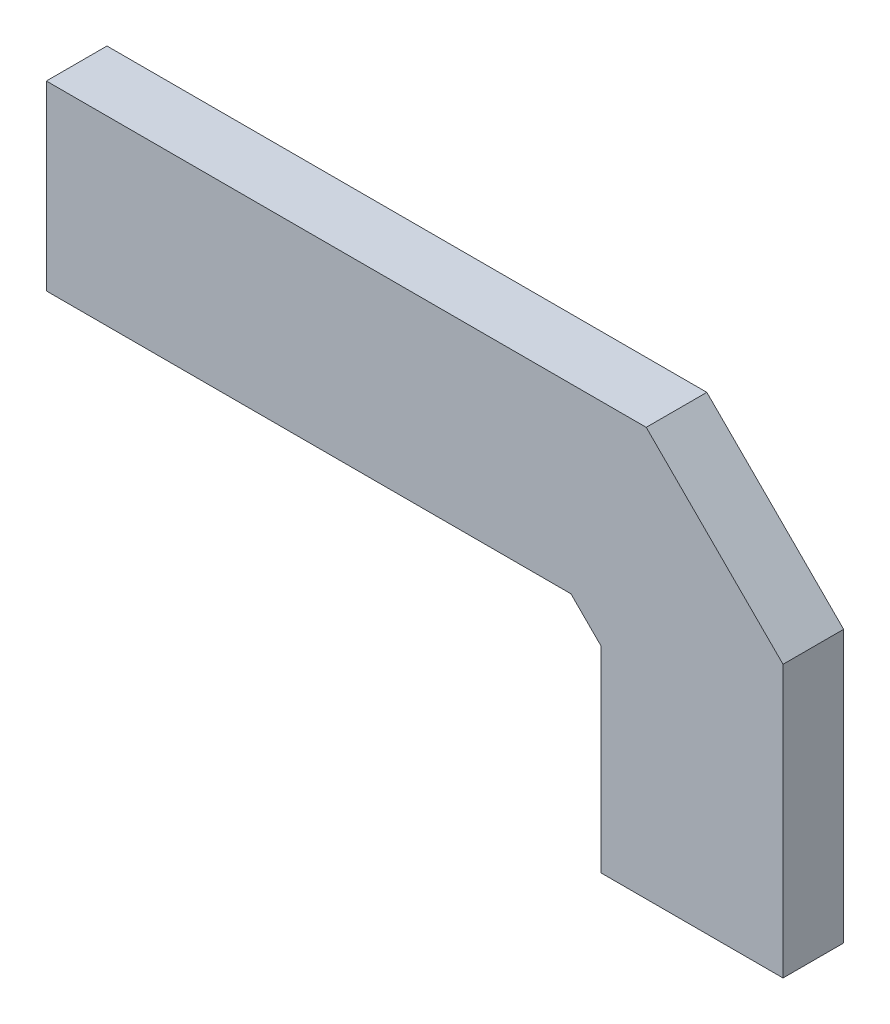
ISO-10303-21;
HEADER;
FILE_DESCRIPTION(('STEP AP214'),'2;1');
FILE_NAME('part.step','',(''),(''),'','','');
FILE_SCHEMA(('AUTOMOTIVE_DESIGN { 1 0 10303 214 1 1 1 1 }'));
ENDSEC;
DATA;
#1=APPLICATION_CONTEXT('core data for automotive mechanical design processes');
#2=APPLICATION_PROTOCOL_DEFINITION('international standard','automotive_design',2000,#1);
#3=PRODUCT_CONTEXT('',#1,'mechanical');
#4=PRODUCT('Part','Part','',(#3));
#5=PRODUCT_RELATED_PRODUCT_CATEGORY('part','',(#4));
#6=PRODUCT_DEFINITION_FORMATION('','',#4);
#7=PRODUCT_DEFINITION_CONTEXT('part definition',#1,'design');
#8=PRODUCT_DEFINITION('design','',#6,#7);
#9=PRODUCT_DEFINITION_SHAPE('','',#8);
#10=(LENGTH_UNIT() NAMED_UNIT(*) SI_UNIT(.MILLI.,.METRE.));
#11=(NAMED_UNIT(*) PLANE_ANGLE_UNIT() SI_UNIT($,.RADIAN.));
#12=(NAMED_UNIT(*) SI_UNIT($,.STERADIAN.) SOLID_ANGLE_UNIT());
#13=UNCERTAINTY_MEASURE_WITH_UNIT(LENGTH_MEASURE(1.E-05),#10,'distance_accuracy_value','');
#14=(GEOMETRIC_REPRESENTATION_CONTEXT(3) GLOBAL_UNCERTAINTY_ASSIGNED_CONTEXT((#13)) GLOBAL_UNIT_ASSIGNED_CONTEXT((#10,
#11,#12)) REPRESENTATION_CONTEXT('',''));
#15=CARTESIAN_POINT('',(0.,0.,0.));
#16=DIRECTION('',(0.,0.,1.));
#17=DIRECTION('',(1.,0.,0.));
#18=AXIS2_PLACEMENT_3D('',#15,#16,#17);
#19=CARTESIAN_POINT('',(0.,0.,0.5));
#20=DIRECTION('',(0.,0.,1.));
#21=DIRECTION('',(1.,0.,0.));
#22=AXIS2_PLACEMENT_3D('',#19,#20,#21);
#23=PLANE('',#22);
#24=DIRECTION('',(0.,-1.,0.));
#25=VECTOR('',#24,1.);
#26=CARTESIAN_POINT('',(33.1099999999967,0.,0.5));
#27=LINE('',#26,#25);
#28=CARTESIAN_POINT('',(33.1099999999967,-0.621320343562755,0.5));
#29=VERTEX_POINT('',#28);
#30=CARTESIAN_POINT('',(33.1099999999967,-2.2413203435653,0.5));
#31=VERTEX_POINT('',#30);
#32=EDGE_CURVE('E11',#29,#31,#27,.T.);
#33=ORIENTED_EDGE('',*,*,#32,.T.);
#34=DIRECTION('',(1.,0.,0.));
#35=VECTOR('',#34,1.);
#36=CARTESIAN_POINT('',(0.,-2.2413203435652,0.5));
#37=LINE('',#36,#35);
#38=CARTESIAN_POINT('',(34.6100000000004,-2.2413203435653,0.5));
#39=VERTEX_POINT('',#38);
#40=EDGE_CURVE('E24',#31,#39,#37,.T.);
#41=ORIENTED_EDGE('',*,*,#40,.T.);
#42=DIRECTION('',(0.,1.,0.));
#43=VECTOR('',#42,1.);
#44=CARTESIAN_POINT('',(34.6100000000005,-2.41073942293827E-13,0.5));
#45=LINE('',#44,#43);
#46=CARTESIAN_POINT('',(34.6100000000005,0.,0.5));
#47=VERTEX_POINT('',#46);
#48=EDGE_CURVE('E145',#39,#47,#45,.T.);
#49=ORIENTED_EDGE('',*,*,#48,.T.);
#50=DIRECTION('',(-0.70710678118656,0.707106781186535,0.));
#51=VECTOR('',#50,1.);
#52=CARTESIAN_POINT('',(17.3049999999996,17.3050000000002,0.5));
#53=LINE('',#52,#51);
#54=CARTESIAN_POINT('',(33.4813203435665,1.1286796564339,0.5));
#55=VERTEX_POINT('',#54);
#56=EDGE_CURVE('E143',#47,#55,#53,.T.);
#57=ORIENTED_EDGE('',*,*,#56,.T.);
#58=DIRECTION('',(1.,0.,0.));
#59=VECTOR('',#58,1.);
#60=CARTESIAN_POINT('',(0.,1.1286796564339,0.5));
#61=LINE('',#60,#59);
#62=CARTESIAN_POINT('',(28.5325000000004,1.1286796564339,0.5));
#63=VERTEX_POINT('',#62);
#64=EDGE_CURVE('E102',#63,#55,#61,.T.);
#65=ORIENTED_EDGE('',*,*,#64,.F.);
#66=DIRECTION('',(0.,-1.,0.));
#67=VECTOR('',#66,1.);
#68=CARTESIAN_POINT('',(28.5325000000004,0.,0.5));
#69=LINE('',#68,#67);
#70=CARTESIAN_POINT('',(28.5325000000004,-0.371320343572933,0.5));
#71=VERTEX_POINT('',#70);
#72=EDGE_CURVE('E140',#63,#71,#69,.T.);
#73=ORIENTED_EDGE('',*,*,#72,.T.);
#74=DIRECTION('',(1.,0.,0.));
#75=VECTOR('',#74,1.);
#76=CARTESIAN_POINT('',(0.,-0.371320343572807,0.5));
#77=LINE('',#76,#75);
#78=CARTESIAN_POINT('',(32.8600000000069,-0.371320343572952,0.5));
#79=VERTEX_POINT('',#78);
#80=EDGE_CURVE('E138',#71,#79,#77,.T.);
#81=ORIENTED_EDGE('',*,*,#80,.T.);
#82=DIRECTION('',(0.707106781186583,-0.707106781186512,0.));
#83=VECTOR('',#82,1.);
#84=CARTESIAN_POINT('',(16.2443398282153,16.2443398282169,0.5));
#85=LINE('',#84,#83);
#86=EDGE_CURVE('E136',#79,#29,#85,.T.);
#87=ORIENTED_EDGE('',*,*,#86,.T.);
#88=EDGE_LOOP('',(#33,#41,#49,#57,#65,#73,#81,#87));
#89=FACE_BOUND('',#88,.T.);
#90=ADVANCED_FACE('F17',(#89),#23,.T.);
#91=CARTESIAN_POINT('',(34.6100000000005,-2.41073942293827E-13,0.5));
#92=DIRECTION('',(-1.,0.,0.));
#93=DIRECTION('',(0.,-1.,0.));
#94=AXIS2_PLACEMENT_3D('',#91,#92,#93);
#95=PLANE('',#94);
#96=DIRECTION('',(0.,0.,1.));
#97=VECTOR('',#96,1.);
#98=CARTESIAN_POINT('',(34.6100000000004,-2.2413203435653,0.5));
#99=LINE('',#98,#97);
#100=CARTESIAN_POINT('',(34.6100000000004,-2.2413203435653,0.));
#101=VERTEX_POINT('',#100);
#102=EDGE_CURVE('E133',#101,#39,#99,.T.);
#103=ORIENTED_EDGE('',*,*,#102,.F.);
#104=DIRECTION('',(0.,1.,0.));
#105=VECTOR('',#104,1.);
#106=CARTESIAN_POINT('',(34.6100000000005,-2.41073942293827E-13,0.));
#107=LINE('',#106,#105);
#108=CARTESIAN_POINT('',(34.6100000000005,0.,0.));
#109=VERTEX_POINT('',#108);
#110=EDGE_CURVE('E131',#101,#109,#107,.T.);
#111=ORIENTED_EDGE('',*,*,#110,.T.);
#112=DIRECTION('',(0.,0.,-1.));
#113=VECTOR('',#112,1.);
#114=CARTESIAN_POINT('',(34.6100000000005,0.,0.5));
#115=LINE('',#114,#113);
#116=EDGE_CURVE('E97',#47,#109,#115,.T.);
#117=ORIENTED_EDGE('',*,*,#116,.F.);
#118=ORIENTED_EDGE('',*,*,#48,.F.);
#119=EDGE_LOOP('',(#103,#111,#117,#118));
#120=FACE_BOUND('',#119,.T.);
#121=ADVANCED_FACE('F149',(#120),#95,.F.);
#122=CARTESIAN_POINT('',(0.,0.,0.));
#123=DIRECTION('',(0.,0.,1.));
#124=DIRECTION('',(1.,0.,0.));
#125=AXIS2_PLACEMENT_3D('',#122,#123,#124);
#126=PLANE('',#125);
#127=DIRECTION('',(1.,0.,0.));
#128=VECTOR('',#127,1.);
#129=CARTESIAN_POINT('',(0.,-2.2413203435652,0.));
#130=LINE('',#129,#128);
#131=CARTESIAN_POINT('',(33.1099999999967,-2.2413203435653,0.));
#132=VERTEX_POINT('',#131);
#133=EDGE_CURVE('E127',#132,#101,#130,.T.);
#134=ORIENTED_EDGE('',*,*,#133,.F.);
#135=DIRECTION('',(0.,-1.,0.));
#136=VECTOR('',#135,1.);
#137=CARTESIAN_POINT('',(33.1099999999967,0.,0.));
#138=LINE('',#137,#136);
#139=CARTESIAN_POINT('',(33.1099999999967,-0.621320343562755,0.));
#140=VERTEX_POINT('',#139);
#141=EDGE_CURVE('E124',#140,#132,#138,.T.);
#142=ORIENTED_EDGE('',*,*,#141,.F.);
#143=DIRECTION('',(0.707106781186583,-0.707106781186512,0.));
#144=VECTOR('',#143,1.);
#145=CARTESIAN_POINT('',(16.2443398282153,16.2443398282169,0.));
#146=LINE('',#145,#144);
#147=CARTESIAN_POINT('',(32.8600000000069,-0.371320343572952,0.));
#148=VERTEX_POINT('',#147);
#149=EDGE_CURVE('E121',#148,#140,#146,.T.);
#150=ORIENTED_EDGE('',*,*,#149,.F.);
#151=DIRECTION('',(1.,0.,0.));
#152=VECTOR('',#151,1.);
#153=CARTESIAN_POINT('',(0.,-0.371320343572807,0.));
#154=LINE('',#153,#152);
#155=CARTESIAN_POINT('',(28.5325000000004,-0.371320343572933,0.));
#156=VERTEX_POINT('',#155);
#157=EDGE_CURVE('E118',#156,#148,#154,.T.);
#158=ORIENTED_EDGE('',*,*,#157,.F.);
#159=DIRECTION('',(0.,-1.,0.));
#160=VECTOR('',#159,1.);
#161=CARTESIAN_POINT('',(28.5325000000004,0.,0.));
#162=LINE('',#161,#160);
#163=CARTESIAN_POINT('',(28.5325000000004,1.1286796564339,0.));
#164=VERTEX_POINT('',#163);
#165=EDGE_CURVE('E84',#164,#156,#162,.T.);
#166=ORIENTED_EDGE('',*,*,#165,.F.);
#167=DIRECTION('',(1.,0.,0.));
#168=VECTOR('',#167,1.);
#169=CARTESIAN_POINT('',(0.,1.1286796564339,0.));
#170=LINE('',#169,#168);
#171=CARTESIAN_POINT('',(33.4813203435665,1.1286796564339,0.));
#172=VERTEX_POINT('',#171);
#173=EDGE_CURVE('E78',#164,#172,#170,.T.);
#174=ORIENTED_EDGE('',*,*,#173,.T.);
#175=DIRECTION('',(-0.70710678118656,0.707106781186535,0.));
#176=VECTOR('',#175,1.);
#177=CARTESIAN_POINT('',(17.3049999999996,17.3050000000002,0.));
#178=LINE('',#177,#176);
#179=EDGE_CURVE('E82',#109,#172,#178,.T.);
#180=ORIENTED_EDGE('',*,*,#179,.F.);
#181=ORIENTED_EDGE('',*,*,#110,.F.);
#182=EDGE_LOOP('',(#134,#142,#150,#158,#166,#174,#180,#181));
#183=FACE_BOUND('',#182,.T.);
#184=ADVANCED_FACE('F80',(#183),#126,.F.);
#185=CARTESIAN_POINT('',(33.1099999999967,0.,0.5));
#186=DIRECTION('',(1.,0.,0.));
#187=DIRECTION('',(0.,1.,0.));
#188=AXIS2_PLACEMENT_3D('',#185,#186,#187);
#189=PLANE('',#188);
#190=DIRECTION('',(0.,0.,-1.));
#191=VECTOR('',#190,1.);
#192=CARTESIAN_POINT('',(33.1099999999967,-2.2413203435653,0.5));
#193=LINE('',#192,#191);
#194=EDGE_CURVE('E98',#31,#132,#193,.T.);
#195=ORIENTED_EDGE('',*,*,#194,.F.);
#196=ORIENTED_EDGE('',*,*,#32,.F.);
#197=DIRECTION('',(0.,0.,-1.));
#198=VECTOR('',#197,1.);
#199=CARTESIAN_POINT('',(33.1099999999967,-0.621320343562755,0.5));
#200=LINE('',#199,#198);
#201=EDGE_CURVE('E113',#29,#140,#200,.T.);
#202=ORIENTED_EDGE('',*,*,#201,.T.);
#203=ORIENTED_EDGE('',*,*,#141,.T.);
#204=EDGE_LOOP('',(#195,#196,#202,#203));
#205=FACE_BOUND('',#204,.T.);
#206=ADVANCED_FACE('F151',(#205),#189,.F.);
#207=CARTESIAN_POINT('',(16.2443398282153,16.2443398282169,0.5));
#208=DIRECTION('',(0.707106781186512,0.707106781186583,0.));
#209=DIRECTION('',(-0.707106781186583,0.707106781186512,0.));
#210=AXIS2_PLACEMENT_3D('',#207,#208,#209);
#211=PLANE('',#210);
#212=ORIENTED_EDGE('',*,*,#149,.T.);
#213=ORIENTED_EDGE('',*,*,#201,.F.);
#214=ORIENTED_EDGE('',*,*,#86,.F.);
#215=DIRECTION('',(0.,0.,-1.));
#216=VECTOR('',#215,1.);
#217=CARTESIAN_POINT('',(32.8600000000069,-0.371320343572952,0.5));
#218=LINE('',#217,#216);
#219=EDGE_CURVE('E110',#79,#148,#218,.T.);
#220=ORIENTED_EDGE('',*,*,#219,.T.);
#221=EDGE_LOOP('',(#212,#213,#214,#220));
#222=FACE_BOUND('',#221,.T.);
#223=ADVANCED_FACE('F155',(#222),#211,.F.);
#224=CARTESIAN_POINT('',(0.,-0.371320343572807,0.5));
#225=DIRECTION('',(0.,1.,0.));
#226=DIRECTION('',(-1.,0.,0.));
#227=AXIS2_PLACEMENT_3D('',#224,#225,#226);
#228=PLANE('',#227);
#229=ORIENTED_EDGE('',*,*,#157,.T.);
#230=ORIENTED_EDGE('',*,*,#219,.F.);
#231=ORIENTED_EDGE('',*,*,#80,.F.);
#232=DIRECTION('',(0.,0.,-1.));
#233=VECTOR('',#232,1.);
#234=CARTESIAN_POINT('',(28.5325000000004,-0.371320343572933,0.5));
#235=LINE('',#234,#233);
#236=EDGE_CURVE('E105',#71,#156,#235,.T.);
#237=ORIENTED_EDGE('',*,*,#236,.T.);
#238=EDGE_LOOP('',(#229,#230,#231,#237));
#239=FACE_BOUND('',#238,.T.);
#240=ADVANCED_FACE('F158',(#239),#228,.F.);
#241=CARTESIAN_POINT('',(28.5325000000004,0.,0.5));
#242=DIRECTION('',(1.,0.,0.));
#243=DIRECTION('',(0.,1.,0.));
#244=AXIS2_PLACEMENT_3D('',#241,#242,#243);
#245=PLANE('',#244);
#246=ORIENTED_EDGE('',*,*,#165,.T.);
#247=ORIENTED_EDGE('',*,*,#236,.F.);
#248=ORIENTED_EDGE('',*,*,#72,.F.);
#249=DIRECTION('',(0.,0.,-1.));
#250=VECTOR('',#249,1.);
#251=CARTESIAN_POINT('',(28.5325000000004,1.1286796564339,0.5));
#252=LINE('',#251,#250);
#253=EDGE_CURVE('E103',#63,#164,#252,.T.);
#254=ORIENTED_EDGE('',*,*,#253,.T.);
#255=EDGE_LOOP('',(#246,#247,#248,#254));
#256=FACE_BOUND('',#255,.T.);
#257=ADVANCED_FACE('F163',(#256),#245,.F.);
#258=CARTESIAN_POINT('',(0.,1.1286796564339,0.5));
#259=DIRECTION('',(0.,1.,0.));
#260=DIRECTION('',(-1.,0.,0.));
#261=AXIS2_PLACEMENT_3D('',#258,#259,#260);
#262=PLANE('',#261);
#263=ORIENTED_EDGE('',*,*,#173,.F.);
#264=ORIENTED_EDGE('',*,*,#253,.F.);
#265=ORIENTED_EDGE('',*,*,#64,.T.);
#266=DIRECTION('',(0.,0.,-1.));
#267=VECTOR('',#266,1.);
#268=CARTESIAN_POINT('',(33.4813203435665,1.1286796564339,0.5));
#269=LINE('',#268,#267);
#270=EDGE_CURVE('E95',#55,#172,#269,.T.);
#271=ORIENTED_EDGE('',*,*,#270,.T.);
#272=EDGE_LOOP('',(#263,#264,#265,#271));
#273=FACE_BOUND('',#272,.T.);
#274=ADVANCED_FACE('F101',(#273),#262,.T.);
#275=CARTESIAN_POINT('',(17.3049999999996,17.3050000000002,0.5));
#276=DIRECTION('',(-0.707106781186535,-0.70710678118656,0.));
#277=DIRECTION('',(0.70710678118656,-0.707106781186535,0.));
#278=AXIS2_PLACEMENT_3D('',#275,#276,#277);
#279=PLANE('',#278);
#280=ORIENTED_EDGE('',*,*,#179,.T.);
#281=ORIENTED_EDGE('',*,*,#270,.F.);
#282=ORIENTED_EDGE('',*,*,#56,.F.);
#283=ORIENTED_EDGE('',*,*,#116,.T.);
#284=EDGE_LOOP('',(#280,#281,#282,#283));
#285=FACE_BOUND('',#284,.T.);
#286=ADVANCED_FACE('F93',(#285),#279,.F.);
#287=CARTESIAN_POINT('',(3.88578058618805E-13,-2.2413203435652,-0.01));
#288=DIRECTION('',(0.,-1.,0.));
#289=DIRECTION('',(1.,0.,0.));
#290=AXIS2_PLACEMENT_3D('',#287,#288,#289);
#291=PLANE('',#290);
#292=ORIENTED_EDGE('',*,*,#40,.F.);
#293=ORIENTED_EDGE('',*,*,#194,.T.);
#294=ORIENTED_EDGE('',*,*,#133,.T.);
#295=ORIENTED_EDGE('',*,*,#102,.T.);
#296=EDGE_LOOP('',(#292,#293,#294,#295));
#297=FACE_BOUND('',#296,.T.);
#298=ADVANCED_FACE('F150',(#297),#291,.T.);
#299=CLOSED_SHELL('',(#90,#121,#184,#206,#223,#240,#257,#274,#286,#298));
#300=MANIFOLD_SOLID_BREP('B1',#299);
#301=ADVANCED_BREP_SHAPE_REPRESENTATION('',(#18,#300),#14);
#302=SHAPE_DEFINITION_REPRESENTATION(#9,#301);
ENDSEC;
END-ISO-10303-21;
